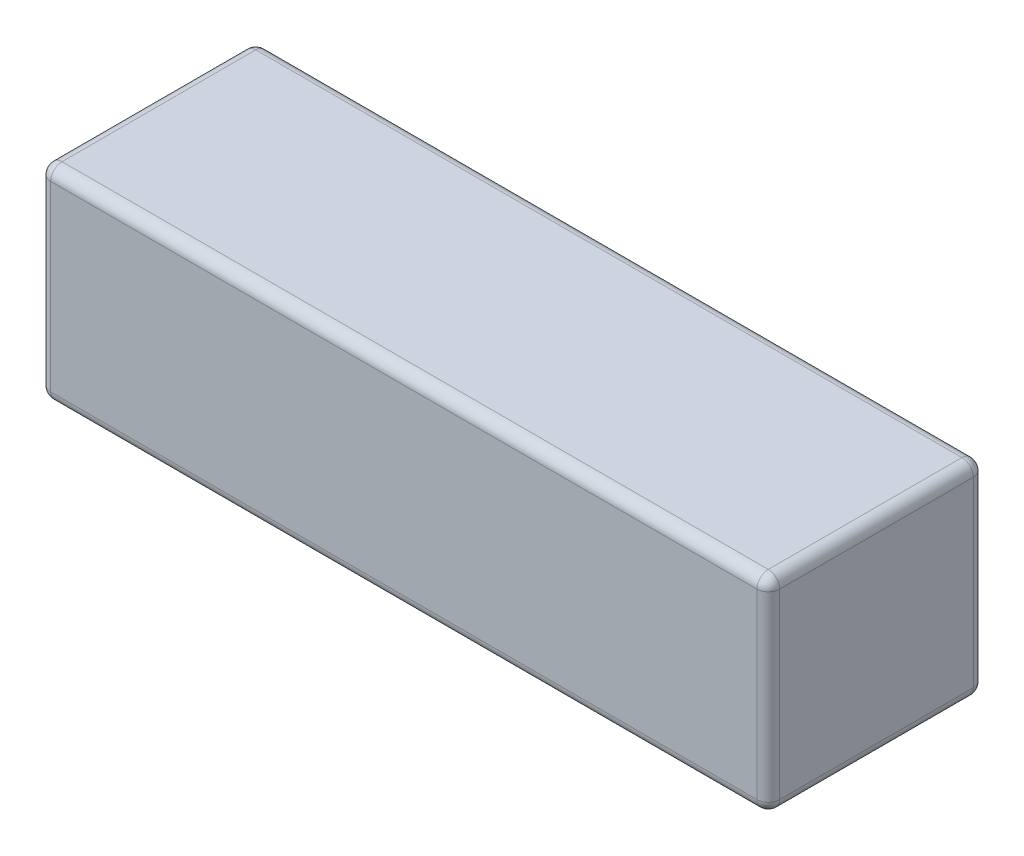
ISO-10303-21;
HEADER;
FILE_DESCRIPTION(('STEP AP214'),'2;1');
FILE_NAME('part.step','',(''),(''),'','','');
FILE_SCHEMA(('AUTOMOTIVE_DESIGN { 1 0 10303 214 1 1 1 1 }'));
ENDSEC;
DATA;
#1=APPLICATION_CONTEXT('core data for automotive mechanical design processes');
#2=APPLICATION_PROTOCOL_DEFINITION('international standard','automotive_design',2000,#1);
#3=PRODUCT_CONTEXT('',#1,'mechanical');
#4=PRODUCT('Part','Part','',(#3));
#5=PRODUCT_RELATED_PRODUCT_CATEGORY('part','',(#4));
#6=PRODUCT_DEFINITION_FORMATION('','',#4);
#7=PRODUCT_DEFINITION_CONTEXT('part definition',#1,'design');
#8=PRODUCT_DEFINITION('design','',#6,#7);
#9=PRODUCT_DEFINITION_SHAPE('','',#8);
#10=(LENGTH_UNIT() NAMED_UNIT(*) SI_UNIT(.MILLI.,.METRE.));
#11=(NAMED_UNIT(*) PLANE_ANGLE_UNIT() SI_UNIT($,.RADIAN.));
#12=(NAMED_UNIT(*) SI_UNIT($,.STERADIAN.) SOLID_ANGLE_UNIT());
#13=UNCERTAINTY_MEASURE_WITH_UNIT(LENGTH_MEASURE(1.E-05),#10,'distance_accuracy_value','');
#14=(GEOMETRIC_REPRESENTATION_CONTEXT(3) GLOBAL_UNCERTAINTY_ASSIGNED_CONTEXT((#13)) GLOBAL_UNIT_ASSIGNED_CONTEXT((#10,
#11,#12)) REPRESENTATION_CONTEXT('',''));
#15=CARTESIAN_POINT('',(0.,0.,0.));
#16=DIRECTION('',(0.,0.,1.));
#17=DIRECTION('',(1.,0.,0.));
#18=AXIS2_PLACEMENT_3D('',#15,#16,#17);
#19=CARTESIAN_POINT('',(0.,18.,0.));
#20=DIRECTION('',(1.,0.,0.));
#21=DIRECTION('',(0.,0.,-1.));
#22=AXIS2_PLACEMENT_3D('',#19,#20,#21);
#23=PLANE('',#22);
#24=DIRECTION('',(0.,0.,1.));
#25=VECTOR('',#24,1.);
#26=CARTESIAN_POINT('',(0.,17.,0.));
#27=LINE('',#26,#25);
#28=CARTESIAN_POINT('',(0.,17.,-1.));
#29=VERTEX_POINT('',#28);
#30=CARTESIAN_POINT('',(0.,17.,-18.));
#31=VERTEX_POINT('',#30);
#32=EDGE_CURVE('E133',#29,#31,#27,.F.);
#33=ORIENTED_EDGE('',*,*,#32,.T.);
#34=DIRECTION('',(0.,-1.,0.));
#35=VECTOR('',#34,1.);
#36=CARTESIAN_POINT('',(0.,18.,-18.));
#37=LINE('',#36,#35);
#38=CARTESIAN_POINT('',(0.,1.,-18.));
#39=VERTEX_POINT('',#38);
#40=EDGE_CURVE('E170',#31,#39,#37,.T.);
#41=ORIENTED_EDGE('',*,*,#40,.T.);
#42=DIRECTION('',(0.,0.,1.));
#43=VECTOR('',#42,1.);
#44=CARTESIAN_POINT('',(0.,1.,0.));
#45=LINE('',#44,#43);
#46=CARTESIAN_POINT('',(0.,1.,-1.));
#47=VERTEX_POINT('',#46);
#48=EDGE_CURVE('E136',#39,#47,#45,.T.);
#49=ORIENTED_EDGE('',*,*,#48,.T.);
#50=DIRECTION('',(0.,-1.,0.));
#51=VECTOR('',#50,1.);
#52=CARTESIAN_POINT('',(0.,18.,-1.));
#53=LINE('',#52,#51);
#54=EDGE_CURVE('E129',#47,#29,#53,.F.);
#55=ORIENTED_EDGE('',*,*,#54,.T.);
#56=EDGE_LOOP('',(#33,#41,#49,#55));
#57=FACE_BOUND('',#56,.T.);
#58=ADVANCED_FACE('F41',(#57),#23,.F.);
#59=CARTESIAN_POINT('',(0.,18.,0.));
#60=DIRECTION('',(0.,0.,-1.));
#61=DIRECTION('',(-1.,0.,0.));
#62=AXIS2_PLACEMENT_3D('',#59,#60,#61);
#63=PLANE('',#62);
#64=DIRECTION('',(1.,0.,0.));
#65=VECTOR('',#64,1.);
#66=CARTESIAN_POINT('',(0.,17.,0.));
#67=LINE('',#66,#65);
#68=CARTESIAN_POINT('',(63.,17.,0.));
#69=VERTEX_POINT('',#68);
#70=CARTESIAN_POINT('',(1.,17.,0.));
#71=VERTEX_POINT('',#70);
#72=EDGE_CURVE('E190',#69,#71,#67,.F.);
#73=ORIENTED_EDGE('',*,*,#72,.T.);
#74=DIRECTION('',(0.,-1.,0.));
#75=VECTOR('',#74,1.);
#76=CARTESIAN_POINT('',(1.,18.,0.));
#77=LINE('',#76,#75);
#78=CARTESIAN_POINT('',(1.,1.,0.));
#79=VERTEX_POINT('',#78);
#80=EDGE_CURVE('E147',#71,#79,#77,.T.);
#81=ORIENTED_EDGE('',*,*,#80,.T.);
#82=DIRECTION('',(1.,0.,0.));
#83=VECTOR('',#82,1.);
#84=CARTESIAN_POINT('',(64.,1.,0.));
#85=LINE('',#84,#83);
#86=CARTESIAN_POINT('',(63.,1.,0.));
#87=VERTEX_POINT('',#86);
#88=EDGE_CURVE('E194',#79,#87,#85,.T.);
#89=ORIENTED_EDGE('',*,*,#88,.T.);
#90=DIRECTION('',(0.,-1.,0.));
#91=VECTOR('',#90,1.);
#92=CARTESIAN_POINT('',(63.,18.,0.));
#93=LINE('',#92,#91);
#94=EDGE_CURVE('E192',#87,#69,#93,.F.);
#95=ORIENTED_EDGE('',*,*,#94,.T.);
#96=EDGE_LOOP('',(#73,#81,#89,#95));
#97=FACE_BOUND('',#96,.T.);
#98=ADVANCED_FACE('F304',(#97),#63,.F.);
#99=CARTESIAN_POINT('',(64.,18.,0.));
#100=DIRECTION('',(-1.,0.,0.));
#101=DIRECTION('',(0.,0.,1.));
#102=AXIS2_PLACEMENT_3D('',#99,#100,#101);
#103=PLANE('',#102);
#104=DIRECTION('',(0.,-1.,0.));
#105=VECTOR('',#104,1.);
#106=CARTESIAN_POINT('',(64.,18.,-1.));
#107=LINE('',#106,#105);
#108=CARTESIAN_POINT('',(64.,17.,-1.));
#109=VERTEX_POINT('',#108);
#110=CARTESIAN_POINT('',(64.,1.,-1.));
#111=VERTEX_POINT('',#110);
#112=EDGE_CURVE('E201',#109,#111,#107,.T.);
#113=ORIENTED_EDGE('',*,*,#112,.T.);
#114=DIRECTION('',(0.,0.,-1.));
#115=VECTOR('',#114,1.);
#116=CARTESIAN_POINT('',(64.,1.,-19.));
#117=LINE('',#116,#115);
#118=CARTESIAN_POINT('',(64.,1.,-18.));
#119=VERTEX_POINT('',#118);
#120=EDGE_CURVE('E204',#111,#119,#117,.T.);
#121=ORIENTED_EDGE('',*,*,#120,.T.);
#122=DIRECTION('',(0.,-1.,0.));
#123=VECTOR('',#122,1.);
#124=CARTESIAN_POINT('',(64.,18.,-18.));
#125=LINE('',#124,#123);
#126=CARTESIAN_POINT('',(64.,17.,-18.));
#127=VERTEX_POINT('',#126);
#128=EDGE_CURVE('E199',#119,#127,#125,.F.);
#129=ORIENTED_EDGE('',*,*,#128,.T.);
#130=DIRECTION('',(0.,0.,-1.));
#131=VECTOR('',#130,1.);
#132=CARTESIAN_POINT('',(64.,17.,0.));
#133=LINE('',#132,#131);
#134=EDGE_CURVE('E197',#127,#109,#133,.F.);
#135=ORIENTED_EDGE('',*,*,#134,.T.);
#136=EDGE_LOOP('',(#113,#121,#129,#135));
#137=FACE_BOUND('',#136,.T.);
#138=ADVANCED_FACE('F281',(#137),#103,.F.);
#139=CARTESIAN_POINT('',(0.,18.,-19.));
#140=DIRECTION('',(0.,0.,1.));
#141=DIRECTION('',(1.,0.,0.));
#142=AXIS2_PLACEMENT_3D('',#139,#140,#141);
#143=PLANE('',#142);
#144=DIRECTION('',(-1.,0.,0.));
#145=VECTOR('',#144,1.);
#146=CARTESIAN_POINT('',(0.,1.,-19.));
#147=LINE('',#146,#145);
#148=CARTESIAN_POINT('',(63.,1.,-19.));
#149=VERTEX_POINT('',#148);
#150=CARTESIAN_POINT('',(1.,1.,-19.));
#151=VERTEX_POINT('',#150);
#152=EDGE_CURVE('E176',#149,#151,#147,.T.);
#153=ORIENTED_EDGE('',*,*,#152,.T.);
#154=DIRECTION('',(0.,-1.,0.));
#155=VECTOR('',#154,1.);
#156=CARTESIAN_POINT('',(1.,18.,-19.));
#157=LINE('',#156,#155);
#158=CARTESIAN_POINT('',(1.,17.,-19.));
#159=VERTEX_POINT('',#158);
#160=EDGE_CURVE('E178',#151,#159,#157,.F.);
#161=ORIENTED_EDGE('',*,*,#160,.T.);
#162=DIRECTION('',(-1.,0.,0.));
#163=VECTOR('',#162,1.);
#164=CARTESIAN_POINT('',(0.,17.,-19.));
#165=LINE('',#164,#163);
#166=CARTESIAN_POINT('',(63.,17.,-19.));
#167=VERTEX_POINT('',#166);
#168=EDGE_CURVE('E172',#159,#167,#165,.F.);
#169=ORIENTED_EDGE('',*,*,#168,.T.);
#170=DIRECTION('',(0.,-1.,0.));
#171=VECTOR('',#170,1.);
#172=CARTESIAN_POINT('',(63.,18.,-19.));
#173=LINE('',#172,#171);
#174=EDGE_CURVE('E174',#167,#149,#173,.T.);
#175=ORIENTED_EDGE('',*,*,#174,.T.);
#176=EDGE_LOOP('',(#153,#161,#169,#175));
#177=FACE_BOUND('',#176,.T.);
#178=ADVANCED_FACE('F311',(#177),#143,.F.);
#179=CARTESIAN_POINT('',(0.,18.,0.));
#180=DIRECTION('',(0.,-1.,0.));
#181=DIRECTION('',(0.,0.,-1.));
#182=AXIS2_PLACEMENT_3D('',#179,#180,#181);
#183=PLANE('',#182);
#184=DIRECTION('',(0.,0.,-1.));
#185=VECTOR('',#184,1.);
#186=CARTESIAN_POINT('',(63.,18.,0.));
#187=LINE('',#186,#185);
#188=CARTESIAN_POINT('',(63.,18.,-1.));
#189=VERTEX_POINT('',#188);
#190=CARTESIAN_POINT('',(63.,18.,-18.));
#191=VERTEX_POINT('',#190);
#192=EDGE_CURVE('E50',#189,#191,#187,.T.);
#193=ORIENTED_EDGE('',*,*,#192,.T.);
#194=DIRECTION('',(-1.,0.,0.));
#195=VECTOR('',#194,1.);
#196=CARTESIAN_POINT('',(0.,18.,-18.));
#197=LINE('',#196,#195);
#198=CARTESIAN_POINT('',(1.,18.,-18.));
#199=VERTEX_POINT('',#198);
#200=EDGE_CURVE('E11',#191,#199,#197,.T.);
#201=ORIENTED_EDGE('',*,*,#200,.T.);
#202=DIRECTION('',(0.,0.,1.));
#203=VECTOR('',#202,1.);
#204=CARTESIAN_POINT('',(1.,18.,0.));
#205=LINE('',#204,#203);
#206=CARTESIAN_POINT('',(1.,18.,-1.));
#207=VERTEX_POINT('',#206);
#208=EDGE_CURVE('E206',#199,#207,#205,.T.);
#209=ORIENTED_EDGE('',*,*,#208,.T.);
#210=DIRECTION('',(1.,0.,0.));
#211=VECTOR('',#210,1.);
#212=CARTESIAN_POINT('',(0.,18.,-1.));
#213=LINE('',#212,#211);
#214=EDGE_CURVE('E61',#207,#189,#213,.T.);
#215=ORIENTED_EDGE('',*,*,#214,.T.);
#216=EDGE_LOOP('',(#193,#201,#209,#215));
#217=FACE_BOUND('',#216,.T.);
#218=ADVANCED_FACE('F374',(#217),#183,.F.);
#219=CARTESIAN_POINT('',(0.,0.,0.));
#220=DIRECTION('',(0.,-1.,0.));
#221=DIRECTION('',(0.,0.,-1.));
#222=AXIS2_PLACEMENT_3D('',#219,#220,#221);
#223=PLANE('',#222);
#224=DIRECTION('',(0.,0.,1.));
#225=VECTOR('',#224,1.);
#226=CARTESIAN_POINT('',(1.,0.,-19.));
#227=LINE('',#226,#225);
#228=CARTESIAN_POINT('',(1.,0.,-1.));
#229=VERTEX_POINT('',#228);
#230=CARTESIAN_POINT('',(1.,0.,-18.));
#231=VERTEX_POINT('',#230);
#232=EDGE_CURVE('E185',#229,#231,#227,.F.);
#233=ORIENTED_EDGE('',*,*,#232,.T.);
#234=DIRECTION('',(-1.,0.,0.));
#235=VECTOR('',#234,1.);
#236=CARTESIAN_POINT('',(64.,0.,-18.));
#237=LINE('',#236,#235);
#238=CARTESIAN_POINT('',(63.,0.,-18.));
#239=VERTEX_POINT('',#238);
#240=EDGE_CURVE('E187',#231,#239,#237,.F.);
#241=ORIENTED_EDGE('',*,*,#240,.T.);
#242=DIRECTION('',(0.,0.,-1.));
#243=VECTOR('',#242,1.);
#244=CARTESIAN_POINT('',(63.,0.,0.));
#245=LINE('',#244,#243);
#246=CARTESIAN_POINT('',(63.,0.,-1.));
#247=VERTEX_POINT('',#246);
#248=EDGE_CURVE('E181',#239,#247,#245,.F.);
#249=ORIENTED_EDGE('',*,*,#248,.T.);
#250=DIRECTION('',(1.,0.,0.));
#251=VECTOR('',#250,1.);
#252=CARTESIAN_POINT('',(0.,0.,-1.));
#253=LINE('',#252,#251);
#254=EDGE_CURVE('E183',#247,#229,#253,.F.);
#255=ORIENTED_EDGE('',*,*,#254,.T.);
#256=EDGE_LOOP('',(#233,#241,#249,#255));
#257=FACE_BOUND('',#256,.T.);
#258=ADVANCED_FACE('F272',(#257),#223,.T.);
#259=CARTESIAN_POINT('',(63.,18.,-1.));
#260=DIRECTION('',(0.,-1.,0.));
#261=DIRECTION('',(0.,0.,-1.));
#262=AXIS2_PLACEMENT_3D('',#259,#260,#261);
#263=CYLINDRICAL_SURFACE('',#262,1.);
#264=CARTESIAN_POINT('',(63.,17.,-1.));
#265=DIRECTION('',(0.,1.,0.));
#266=DIRECTION('',(0.,0.,1.));
#267=AXIS2_PLACEMENT_3D('',#264,#265,#266);
#268=CIRCLE('',#267,1.);
#269=EDGE_CURVE('E45',#69,#109,#268,.T.);
#270=ORIENTED_EDGE('',*,*,#269,.F.);
#271=ORIENTED_EDGE('',*,*,#94,.F.);
#272=CARTESIAN_POINT('',(63.,1.,-1.));
#273=DIRECTION('',(0.,-1.,0.));
#274=DIRECTION('',(0.,0.,-1.));
#275=AXIS2_PLACEMENT_3D('',#272,#273,#274);
#276=CIRCLE('',#275,1.);
#277=EDGE_CURVE('E167',#111,#87,#276,.T.);
#278=ORIENTED_EDGE('',*,*,#277,.F.);
#279=ORIENTED_EDGE('',*,*,#112,.F.);
#280=EDGE_LOOP('',(#270,#271,#278,#279));
#281=FACE_BOUND('',#280,.T.);
#282=ADVANCED_FACE('F43',(#281),#263,.T.);
#283=CARTESIAN_POINT('',(63.,17.,-1.));
#284=DIRECTION('',(1.,0.,0.));
#285=DIRECTION('',(0.,0.,-1.));
#286=AXIS2_PLACEMENT_3D('',#283,#284,#285);
#287=SPHERICAL_SURFACE('',#286,1.);
#288=CARTESIAN_POINT('',(63.,17.,-1.));
#289=DIRECTION('',(1.,0.,0.));
#290=DIRECTION('',(0.,0.,-1.));
#291=AXIS2_PLACEMENT_3D('',#288,#289,#290);
#292=CIRCLE('',#291,1.);
#293=EDGE_CURVE('E252',#69,#189,#292,.F.);
#294=ORIENTED_EDGE('',*,*,#293,.F.);
#295=ORIENTED_EDGE('',*,*,#269,.T.);
#296=CARTESIAN_POINT('',(63.,17.,-1.));
#297=DIRECTION('',(0.,0.,1.));
#298=DIRECTION('',(1.,0.,0.));
#299=AXIS2_PLACEMENT_3D('',#296,#297,#298);
#300=CIRCLE('',#299,1.);
#301=EDGE_CURVE('E254',#189,#109,#300,.F.);
#302=ORIENTED_EDGE('',*,*,#301,.F.);
#303=EDGE_LOOP('',(#294,#295,#302));
#304=FACE_BOUND('',#303,.T.);
#305=ADVANCED_FACE('F299',(#304),#287,.T.);
#306=CARTESIAN_POINT('',(63.,1.,-1.));
#307=DIRECTION('',(0.,0.,1.));
#308=DIRECTION('',(0.,-1.,0.));
#309=AXIS2_PLACEMENT_3D('',#306,#307,#308);
#310=SPHERICAL_SURFACE('',#309,1.);
#311=CARTESIAN_POINT('',(63.,1.,-1.));
#312=DIRECTION('',(0.,0.,1.));
#313=DIRECTION('',(1.,0.,0.));
#314=AXIS2_PLACEMENT_3D('',#311,#312,#313);
#315=CIRCLE('',#314,1.);
#316=EDGE_CURVE('E246',#111,#247,#315,.F.);
#317=ORIENTED_EDGE('',*,*,#316,.F.);
#318=ORIENTED_EDGE('',*,*,#277,.T.);
#319=CARTESIAN_POINT('',(63.,1.,-1.));
#320=DIRECTION('',(1.,0.,0.));
#321=DIRECTION('',(0.,0.,-1.));
#322=AXIS2_PLACEMENT_3D('',#319,#320,#321);
#323=CIRCLE('',#322,1.);
#324=EDGE_CURVE('E249',#247,#87,#323,.F.);
#325=ORIENTED_EDGE('',*,*,#324,.F.);
#326=EDGE_LOOP('',(#317,#318,#325));
#327=FACE_BOUND('',#326,.T.);
#328=ADVANCED_FACE('F261',(#327),#310,.T.);
#329=CARTESIAN_POINT('',(63.,17.,0.));
#330=DIRECTION('',(0.,0.,-1.));
#331=DIRECTION('',(-1.,0.,0.));
#332=AXIS2_PLACEMENT_3D('',#329,#330,#331);
#333=CYLINDRICAL_SURFACE('',#332,1.);
#334=ORIENTED_EDGE('',*,*,#301,.T.);
#335=ORIENTED_EDGE('',*,*,#134,.F.);
#336=CARTESIAN_POINT('',(63.,17.,-18.));
#337=DIRECTION('',(0.,0.,-1.));
#338=DIRECTION('',(-1.,0.,0.));
#339=AXIS2_PLACEMENT_3D('',#336,#337,#338);
#340=CIRCLE('',#339,1.);
#341=EDGE_CURVE('E240',#191,#127,#340,.T.);
#342=ORIENTED_EDGE('',*,*,#341,.F.);
#343=ORIENTED_EDGE('',*,*,#192,.F.);
#344=EDGE_LOOP('',(#334,#335,#342,#343));
#345=FACE_BOUND('',#344,.T.);
#346=ADVANCED_FACE('F294',(#345),#333,.T.);
#347=CARTESIAN_POINT('',(0.,17.,-1.));
#348=DIRECTION('',(1.,0.,0.));
#349=DIRECTION('',(0.,0.,-1.));
#350=AXIS2_PLACEMENT_3D('',#347,#348,#349);
#351=CYLINDRICAL_SURFACE('',#350,1.);
#352=ORIENTED_EDGE('',*,*,#293,.T.);
#353=ORIENTED_EDGE('',*,*,#214,.F.);
#354=CARTESIAN_POINT('',(1.,17.,-1.));
#355=DIRECTION('',(-1.,0.,0.));
#356=DIRECTION('',(0.,0.,1.));
#357=AXIS2_PLACEMENT_3D('',#354,#355,#356);
#358=CIRCLE('',#357,1.);
#359=EDGE_CURVE('E151',#71,#207,#358,.T.);
#360=ORIENTED_EDGE('',*,*,#359,.F.);
#361=ORIENTED_EDGE('',*,*,#72,.F.);
#362=EDGE_LOOP('',(#352,#353,#360,#361));
#363=FACE_BOUND('',#362,.T.);
#364=ADVANCED_FACE('F302',(#363),#351,.T.);
#365=CARTESIAN_POINT('',(1.,18.,-1.));
#366=DIRECTION('',(0.,-1.,0.));
#367=DIRECTION('',(0.,0.,-1.));
#368=AXIS2_PLACEMENT_3D('',#365,#366,#367);
#369=CYLINDRICAL_SURFACE('',#368,1.);
#370=CARTESIAN_POINT('',(1.,1.,-1.));
#371=DIRECTION('',(0.,-1.,0.));
#372=DIRECTION('',(0.,0.,-1.));
#373=AXIS2_PLACEMENT_3D('',#370,#371,#372);
#374=CIRCLE('',#373,1.);
#375=EDGE_CURVE('E152',#79,#47,#374,.T.);
#376=ORIENTED_EDGE('',*,*,#375,.F.);
#377=ORIENTED_EDGE('',*,*,#80,.F.);
#378=CARTESIAN_POINT('',(1.,17.,-1.));
#379=DIRECTION('',(0.,1.,0.));
#380=DIRECTION('',(0.,0.,1.));
#381=AXIS2_PLACEMENT_3D('',#378,#379,#380);
#382=CIRCLE('',#381,1.);
#383=EDGE_CURVE('E143',#29,#71,#382,.T.);
#384=ORIENTED_EDGE('',*,*,#383,.F.);
#385=ORIENTED_EDGE('',*,*,#54,.F.);
#386=EDGE_LOOP('',(#376,#377,#384,#385));
#387=FACE_BOUND('',#386,.T.);
#388=ADVANCED_FACE('F145',(#387),#369,.T.);
#389=CARTESIAN_POINT('',(0.,1.,-1.));
#390=DIRECTION('',(-1.,0.,0.));
#391=DIRECTION('',(0.,0.,1.));
#392=AXIS2_PLACEMENT_3D('',#389,#390,#391);
#393=CYLINDRICAL_SURFACE('',#392,1.);
#394=ORIENTED_EDGE('',*,*,#324,.T.);
#395=ORIENTED_EDGE('',*,*,#88,.F.);
#396=CARTESIAN_POINT('',(1.,1.,-1.));
#397=DIRECTION('',(-1.,0.,0.));
#398=DIRECTION('',(0.,0.,1.));
#399=AXIS2_PLACEMENT_3D('',#396,#397,#398);
#400=CIRCLE('',#399,1.);
#401=EDGE_CURVE('E236',#229,#79,#400,.T.);
#402=ORIENTED_EDGE('',*,*,#401,.F.);
#403=ORIENTED_EDGE('',*,*,#254,.F.);
#404=EDGE_LOOP('',(#394,#395,#402,#403));
#405=FACE_BOUND('',#404,.T.);
#406=ADVANCED_FACE('F268',(#405),#393,.T.);
#407=CARTESIAN_POINT('',(63.,1.,0.));
#408=DIRECTION('',(0.,0.,1.));
#409=DIRECTION('',(1.,0.,0.));
#410=AXIS2_PLACEMENT_3D('',#407,#408,#409);
#411=CYLINDRICAL_SURFACE('',#410,1.);
#412=ORIENTED_EDGE('',*,*,#316,.T.);
#413=ORIENTED_EDGE('',*,*,#248,.F.);
#414=CARTESIAN_POINT('',(63.,1.,-18.));
#415=DIRECTION('',(0.,0.,-1.));
#416=DIRECTION('',(-1.,0.,0.));
#417=AXIS2_PLACEMENT_3D('',#414,#415,#416);
#418=CIRCLE('',#417,1.);
#419=EDGE_CURVE('E233',#119,#239,#418,.T.);
#420=ORIENTED_EDGE('',*,*,#419,.F.);
#421=ORIENTED_EDGE('',*,*,#120,.F.);
#422=EDGE_LOOP('',(#412,#413,#420,#421));
#423=FACE_BOUND('',#422,.T.);
#424=ADVANCED_FACE('F278',(#423),#411,.T.);
#425=CARTESIAN_POINT('',(63.,18.,-18.));
#426=DIRECTION('',(0.,-1.,0.));
#427=DIRECTION('',(0.,0.,-1.));
#428=AXIS2_PLACEMENT_3D('',#425,#426,#427);
#429=CYLINDRICAL_SURFACE('',#428,1.);
#430=CARTESIAN_POINT('',(63.,17.,-18.));
#431=DIRECTION('',(0.,1.,0.));
#432=DIRECTION('',(0.,0.,1.));
#433=AXIS2_PLACEMENT_3D('',#430,#431,#432);
#434=CIRCLE('',#433,1.);
#435=EDGE_CURVE('E243',#127,#167,#434,.T.);
#436=ORIENTED_EDGE('',*,*,#435,.F.);
#437=ORIENTED_EDGE('',*,*,#128,.F.);
#438=CARTESIAN_POINT('',(63.,1.,-18.));
#439=DIRECTION('',(0.,-1.,0.));
#440=DIRECTION('',(0.,0.,-1.));
#441=AXIS2_PLACEMENT_3D('',#438,#439,#440);
#442=CIRCLE('',#441,1.);
#443=EDGE_CURVE('E230',#149,#119,#442,.T.);
#444=ORIENTED_EDGE('',*,*,#443,.F.);
#445=ORIENTED_EDGE('',*,*,#174,.F.);
#446=EDGE_LOOP('',(#436,#437,#444,#445));
#447=FACE_BOUND('',#446,.T.);
#448=ADVANCED_FACE('F286',(#447),#429,.T.);
#449=CARTESIAN_POINT('',(63.,17.,-18.));
#450=DIRECTION('',(1.,0.,0.));
#451=DIRECTION('',(0.,0.,-1.));
#452=AXIS2_PLACEMENT_3D('',#449,#450,#451);
#453=SPHERICAL_SURFACE('',#452,1.);
#454=ORIENTED_EDGE('',*,*,#341,.T.);
#455=ORIENTED_EDGE('',*,*,#435,.T.);
#456=CARTESIAN_POINT('',(63.,17.,-18.));
#457=DIRECTION('',(1.,0.,0.));
#458=DIRECTION('',(0.,0.,-1.));
#459=AXIS2_PLACEMENT_3D('',#456,#457,#458);
#460=CIRCLE('',#459,1.);
#461=EDGE_CURVE('E159',#191,#167,#460,.F.);
#462=ORIENTED_EDGE('',*,*,#461,.F.);
#463=EDGE_LOOP('',(#454,#455,#462));
#464=FACE_BOUND('',#463,.T.);
#465=ADVANCED_FACE('F291',(#464),#453,.T.);
#466=CARTESIAN_POINT('',(1.,17.,-1.));
#467=DIRECTION('',(0.,0.,1.));
#468=DIRECTION('',(1.,0.,0.));
#469=AXIS2_PLACEMENT_3D('',#466,#467,#468);
#470=SPHERICAL_SURFACE('',#469,1.);
#471=ORIENTED_EDGE('',*,*,#383,.T.);
#472=ORIENTED_EDGE('',*,*,#359,.T.);
#473=CARTESIAN_POINT('',(1.,17.,-1.));
#474=DIRECTION('',(0.,0.,1.));
#475=DIRECTION('',(1.,0.,0.));
#476=AXIS2_PLACEMENT_3D('',#473,#474,#475);
#477=CIRCLE('',#476,1.);
#478=EDGE_CURVE('E155',#29,#207,#477,.F.);
#479=ORIENTED_EDGE('',*,*,#478,.F.);
#480=EDGE_LOOP('',(#471,#472,#479));
#481=FACE_BOUND('',#480,.T.);
#482=ADVANCED_FACE('F156',(#481),#470,.T.);
#483=CARTESIAN_POINT('',(1.,1.,-1.));
#484=DIRECTION('',(0.,0.,1.));
#485=DIRECTION('',(0.,-1.,0.));
#486=AXIS2_PLACEMENT_3D('',#483,#484,#485);
#487=SPHERICAL_SURFACE('',#486,1.);
#488=ORIENTED_EDGE('',*,*,#401,.T.);
#489=ORIENTED_EDGE('',*,*,#375,.T.);
#490=CARTESIAN_POINT('',(1.,1.,-1.));
#491=DIRECTION('',(0.,0.,1.));
#492=DIRECTION('',(1.,0.,0.));
#493=AXIS2_PLACEMENT_3D('',#490,#491,#492);
#494=CIRCLE('',#493,1.);
#495=EDGE_CURVE('E160',#229,#47,#494,.F.);
#496=ORIENTED_EDGE('',*,*,#495,.F.);
#497=EDGE_LOOP('',(#488,#489,#496));
#498=FACE_BOUND('',#497,.T.);
#499=ADVANCED_FACE('F345',(#498),#487,.T.);
#500=CARTESIAN_POINT('',(63.,1.,-18.));
#501=DIRECTION('',(1.,0.,0.));
#502=DIRECTION('',(0.,1.,0.));
#503=AXIS2_PLACEMENT_3D('',#500,#501,#502);
#504=SPHERICAL_SURFACE('',#503,1.);
#505=ORIENTED_EDGE('',*,*,#443,.T.);
#506=ORIENTED_EDGE('',*,*,#419,.T.);
#507=CARTESIAN_POINT('',(63.,1.,-18.));
#508=DIRECTION('',(1.,0.,0.));
#509=DIRECTION('',(0.,0.,-1.));
#510=AXIS2_PLACEMENT_3D('',#507,#508,#509);
#511=CIRCLE('',#510,1.);
#512=EDGE_CURVE('E224',#149,#239,#511,.F.);
#513=ORIENTED_EDGE('',*,*,#512,.F.);
#514=EDGE_LOOP('',(#505,#506,#513));
#515=FACE_BOUND('',#514,.T.);
#516=ADVANCED_FACE('F341',(#515),#504,.T.);
#517=CARTESIAN_POINT('',(0.,17.,-18.));
#518=DIRECTION('',(-1.,0.,0.));
#519=DIRECTION('',(0.,0.,1.));
#520=AXIS2_PLACEMENT_3D('',#517,#518,#519);
#521=CYLINDRICAL_SURFACE('',#520,1.);
#522=ORIENTED_EDGE('',*,*,#461,.T.);
#523=ORIENTED_EDGE('',*,*,#168,.F.);
#524=CARTESIAN_POINT('',(1.,17.,-18.));
#525=DIRECTION('',(-1.,0.,0.));
#526=DIRECTION('',(0.,0.,1.));
#527=AXIS2_PLACEMENT_3D('',#524,#525,#526);
#528=CIRCLE('',#527,1.);
#529=EDGE_CURVE('E221',#199,#159,#528,.T.);
#530=ORIENTED_EDGE('',*,*,#529,.F.);
#531=ORIENTED_EDGE('',*,*,#200,.F.);
#532=EDGE_LOOP('',(#522,#523,#530,#531));
#533=FACE_BOUND('',#532,.T.);
#534=ADVANCED_FACE('F338',(#533),#521,.T.);
#535=CARTESIAN_POINT('',(1.,17.,0.));
#536=DIRECTION('',(0.,0.,1.));
#537=DIRECTION('',(1.,0.,0.));
#538=AXIS2_PLACEMENT_3D('',#535,#536,#537);
#539=CYLINDRICAL_SURFACE('',#538,1.);
#540=ORIENTED_EDGE('',*,*,#478,.T.);
#541=ORIENTED_EDGE('',*,*,#208,.F.);
#542=CARTESIAN_POINT('',(1.,17.,-18.));
#543=DIRECTION('',(0.,0.,-1.));
#544=DIRECTION('',(-1.,0.,0.));
#545=AXIS2_PLACEMENT_3D('',#542,#543,#544);
#546=CIRCLE('',#545,1.);
#547=EDGE_CURVE('E163',#31,#199,#546,.T.);
#548=ORIENTED_EDGE('',*,*,#547,.F.);
#549=ORIENTED_EDGE('',*,*,#32,.F.);
#550=EDGE_LOOP('',(#540,#541,#548,#549));
#551=FACE_BOUND('',#550,.T.);
#552=ADVANCED_FACE('F162',(#551),#539,.T.);
#553=CARTESIAN_POINT('',(1.,1.,0.));
#554=DIRECTION('',(0.,0.,-1.));
#555=DIRECTION('',(-1.,0.,0.));
#556=AXIS2_PLACEMENT_3D('',#553,#554,#555);
#557=CYLINDRICAL_SURFACE('',#556,1.);
#558=ORIENTED_EDGE('',*,*,#495,.T.);
#559=ORIENTED_EDGE('',*,*,#48,.F.);
#560=CARTESIAN_POINT('',(1.,1.,-18.));
#561=DIRECTION('',(0.,0.,-1.));
#562=DIRECTION('',(-1.,0.,0.));
#563=AXIS2_PLACEMENT_3D('',#560,#561,#562);
#564=CIRCLE('',#563,1.);
#565=EDGE_CURVE('E217',#231,#39,#564,.T.);
#566=ORIENTED_EDGE('',*,*,#565,.F.);
#567=ORIENTED_EDGE('',*,*,#232,.F.);
#568=EDGE_LOOP('',(#558,#559,#566,#567));
#569=FACE_BOUND('',#568,.T.);
#570=ADVANCED_FACE('F331',(#569),#557,.T.);
#571=CARTESIAN_POINT('',(0.,1.,-18.));
#572=DIRECTION('',(1.,0.,0.));
#573=DIRECTION('',(0.,0.,-1.));
#574=AXIS2_PLACEMENT_3D('',#571,#572,#573);
#575=CYLINDRICAL_SURFACE('',#574,1.);
#576=ORIENTED_EDGE('',*,*,#512,.T.);
#577=ORIENTED_EDGE('',*,*,#240,.F.);
#578=CARTESIAN_POINT('',(1.,1.,-18.));
#579=DIRECTION('',(-1.,0.,0.));
#580=DIRECTION('',(0.,0.,1.));
#581=AXIS2_PLACEMENT_3D('',#578,#579,#580);
#582=CIRCLE('',#581,1.);
#583=EDGE_CURVE('E214',#151,#231,#582,.T.);
#584=ORIENTED_EDGE('',*,*,#583,.F.);
#585=ORIENTED_EDGE('',*,*,#152,.F.);
#586=EDGE_LOOP('',(#576,#577,#584,#585));
#587=FACE_BOUND('',#586,.T.);
#588=ADVANCED_FACE('F327',(#587),#575,.T.);
#589=CARTESIAN_POINT('',(1.,17.,-18.));
#590=DIRECTION('',(0.,1.,0.));
#591=DIRECTION('',(0.,0.,1.));
#592=AXIS2_PLACEMENT_3D('',#589,#590,#591);
#593=SPHERICAL_SURFACE('',#592,1.);
#594=ORIENTED_EDGE('',*,*,#547,.T.);
#595=ORIENTED_EDGE('',*,*,#529,.T.);
#596=CARTESIAN_POINT('',(1.,17.,-18.));
#597=DIRECTION('',(0.,1.,0.));
#598=DIRECTION('',(0.,0.,1.));
#599=AXIS2_PLACEMENT_3D('',#596,#597,#598);
#600=CIRCLE('',#599,1.);
#601=EDGE_CURVE('E212',#31,#159,#600,.F.);
#602=ORIENTED_EDGE('',*,*,#601,.F.);
#603=EDGE_LOOP('',(#594,#595,#602));
#604=FACE_BOUND('',#603,.T.);
#605=ADVANCED_FACE('F323',(#604),#593,.T.);
#606=CARTESIAN_POINT('',(1.,1.,-18.));
#607=DIRECTION('',(0.,-1.,0.));
#608=DIRECTION('',(0.,0.,-1.));
#609=AXIS2_PLACEMENT_3D('',#606,#607,#608);
#610=SPHERICAL_SURFACE('',#609,1.);
#611=ORIENTED_EDGE('',*,*,#583,.T.);
#612=ORIENTED_EDGE('',*,*,#565,.T.);
#613=CARTESIAN_POINT('',(1.,1.,-18.));
#614=DIRECTION('',(0.,-1.,0.));
#615=DIRECTION('',(0.,0.,-1.));
#616=AXIS2_PLACEMENT_3D('',#613,#614,#615);
#617=CIRCLE('',#616,1.);
#618=EDGE_CURVE('E210',#151,#39,#617,.F.);
#619=ORIENTED_EDGE('',*,*,#618,.F.);
#620=EDGE_LOOP('',(#611,#612,#619));
#621=FACE_BOUND('',#620,.T.);
#622=ADVANCED_FACE('F319',(#621),#610,.T.);
#623=CARTESIAN_POINT('',(1.,18.,-18.));
#624=DIRECTION('',(0.,-1.,0.));
#625=DIRECTION('',(0.,0.,-1.));
#626=AXIS2_PLACEMENT_3D('',#623,#624,#625);
#627=CYLINDRICAL_SURFACE('',#626,1.);
#628=ORIENTED_EDGE('',*,*,#601,.T.);
#629=ORIENTED_EDGE('',*,*,#160,.F.);
#630=ORIENTED_EDGE('',*,*,#618,.T.);
#631=ORIENTED_EDGE('',*,*,#40,.F.);
#632=EDGE_LOOP('',(#628,#629,#630,#631));
#633=FACE_BOUND('',#632,.T.);
#634=ADVANCED_FACE('F316',(#633),#627,.T.);
#635=CLOSED_SHELL('',(#58,#98,#138,#178,#218,#258,#282,#305,#328,#346,#364,#388,#406,#424,#448,
#465,#482,#499,#516,#534,#552,#570,#588,#605,#622,#634));
#636=MANIFOLD_SOLID_BREP('B2',#635);
#637=ADVANCED_BREP_SHAPE_REPRESENTATION('',(#18,#636),#14);
#638=SHAPE_DEFINITION_REPRESENTATION(#9,#637);
ENDSEC;
END-ISO-10303-21;
